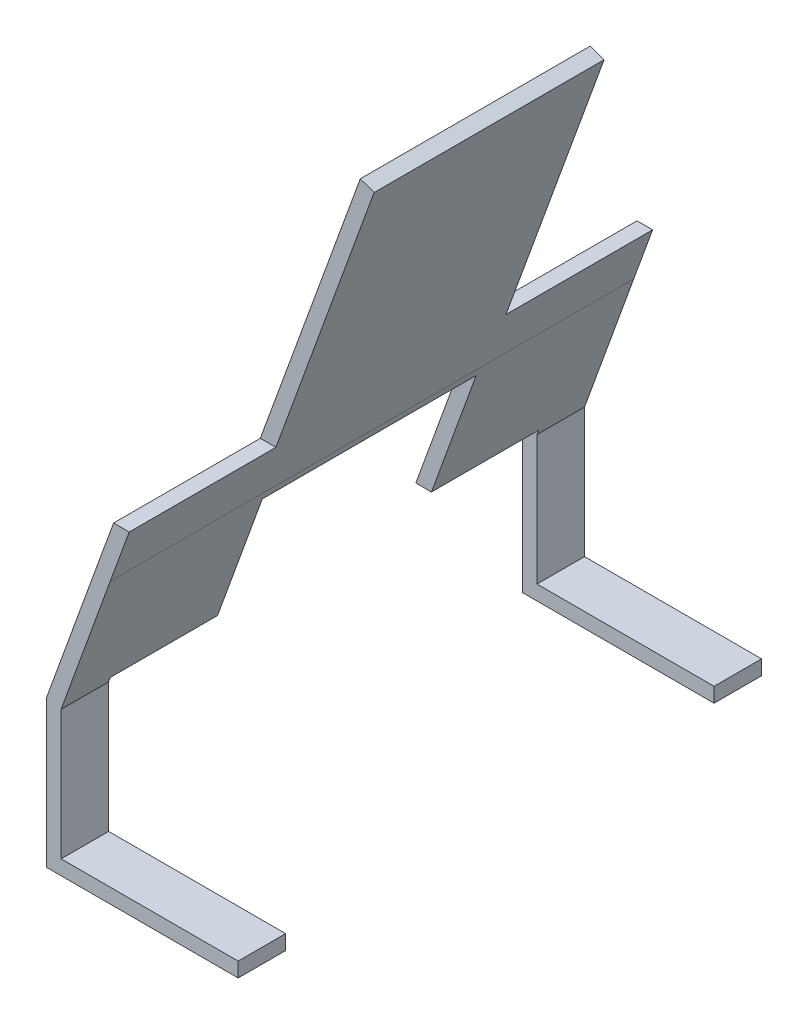
ISO-10303-21;
HEADER;
FILE_DESCRIPTION(('STEP AP214'),'2;1');
FILE_NAME('part.step','',(''),(''),'','','');
FILE_SCHEMA(('AUTOMOTIVE_DESIGN { 1 0 10303 214 1 1 1 1 }'));
ENDSEC;
DATA;
#1=APPLICATION_CONTEXT('core data for automotive mechanical design processes');
#2=APPLICATION_PROTOCOL_DEFINITION('international standard','automotive_design',2000,#1);
#3=PRODUCT_CONTEXT('',#1,'mechanical');
#4=PRODUCT('Part','Part','',(#3));
#5=PRODUCT_RELATED_PRODUCT_CATEGORY('part','',(#4));
#6=PRODUCT_DEFINITION_FORMATION('','',#4);
#7=PRODUCT_DEFINITION_CONTEXT('part definition',#1,'design');
#8=PRODUCT_DEFINITION('design','',#6,#7);
#9=PRODUCT_DEFINITION_SHAPE('','',#8);
#10=(LENGTH_UNIT() NAMED_UNIT(*) SI_UNIT(.MILLI.,.METRE.));
#11=(NAMED_UNIT(*) PLANE_ANGLE_UNIT() SI_UNIT($,.RADIAN.));
#12=(NAMED_UNIT(*) SI_UNIT($,.STERADIAN.) SOLID_ANGLE_UNIT());
#13=UNCERTAINTY_MEASURE_WITH_UNIT(LENGTH_MEASURE(1.E-05),#10,'distance_accuracy_value','');
#14=(GEOMETRIC_REPRESENTATION_CONTEXT(3) GLOBAL_UNCERTAINTY_ASSIGNED_CONTEXT((#13)) GLOBAL_UNIT_ASSIGNED_CONTEXT((#10,
#11,#12)) REPRESENTATION_CONTEXT('',''));
#15=CARTESIAN_POINT('',(0.,0.,0.));
#16=DIRECTION('',(0.,0.,1.));
#17=DIRECTION('',(1.,0.,0.));
#18=AXIS2_PLACEMENT_3D('',#15,#16,#17);
#19=CARTESIAN_POINT('',(-39.1925252630304,0.,107.));
#20=DIRECTION('',(0.,1.,0.));
#21=DIRECTION('',(0.,0.,1.));
#22=AXIS2_PLACEMENT_3D('',#19,#20,#21);
#23=PLANE('',#22);
#24=DIRECTION('',(-1.,0.,0.));
#25=VECTOR('',#24,1.);
#26=CARTESIAN_POINT('',(107.,0.,97.2882216309704));
#27=LINE('',#26,#25);
#28=CARTESIAN_POINT('',(0.,0.,97.2882216309704));
#29=VERTEX_POINT('',#28);
#30=CARTESIAN_POINT('',(-39.1925252630304,0.,97.2882216309704));
#31=VERTEX_POINT('',#30);
#32=EDGE_CURVE('E405',#29,#31,#27,.T.);
#33=ORIENTED_EDGE('',*,*,#32,.F.);
#34=DIRECTION('',(0.,0.,-1.));
#35=VECTOR('',#34,1.);
#36=CARTESIAN_POINT('',(0.,0.,107.));
#37=LINE('',#36,#35);
#38=CARTESIAN_POINT('',(0.,0.,107.));
#39=VERTEX_POINT('',#38);
#40=EDGE_CURVE('E353',#39,#29,#37,.T.);
#41=ORIENTED_EDGE('',*,*,#40,.F.);
#42=DIRECTION('',(1.,0.,0.));
#43=VECTOR('',#42,1.);
#44=CARTESIAN_POINT('',(-39.1925252630304,0.,107.));
#45=LINE('',#44,#43);
#46=CARTESIAN_POINT('',(-39.1925252630304,0.,107.));
#47=VERTEX_POINT('',#46);
#48=EDGE_CURVE('E280',#47,#39,#45,.T.);
#49=ORIENTED_EDGE('',*,*,#48,.F.);
#50=DIRECTION('',(0.,0.,-1.));
#51=VECTOR('',#50,1.);
#52=CARTESIAN_POINT('',(-39.1925252630304,0.,107.));
#53=LINE('',#52,#51);
#54=EDGE_CURVE('E323',#47,#31,#53,.T.);
#55=ORIENTED_EDGE('',*,*,#54,.T.);
#56=EDGE_LOOP('',(#33,#41,#49,#55));
#57=FACE_BOUND('',#56,.T.);
#58=ADVANCED_FACE('F39',(#57),#23,.F.);
#59=DIRECTION('',(-1.,0.,0.));
#60=VECTOR('',#59,1.);
#61=CARTESIAN_POINT('',(107.,0.,9.71177836902959));
#62=LINE('',#61,#60);
#63=CARTESIAN_POINT('',(0.,0.,9.71177836902959));
#64=VERTEX_POINT('',#63);
#65=CARTESIAN_POINT('',(-39.1925252630304,0.,9.71177836902959));
#66=VERTEX_POINT('',#65);
#67=EDGE_CURVE('E388',#64,#66,#62,.T.);
#68=ORIENTED_EDGE('',*,*,#67,.T.);
#69=CARTESIAN_POINT('',(-39.1925252630304,0.,0.));
#70=VERTEX_POINT('',#69);
#71=EDGE_CURVE('E301',#66,#70,#53,.T.);
#72=ORIENTED_EDGE('',*,*,#71,.T.);
#73=DIRECTION('',(1.,0.,0.));
#74=VECTOR('',#73,1.);
#75=CARTESIAN_POINT('',(-39.1925252630304,0.,0.));
#76=LINE('',#75,#74);
#77=CARTESIAN_POINT('',(0.,0.,0.));
#78=VERTEX_POINT('',#77);
#79=EDGE_CURVE('E279',#70,#78,#76,.T.);
#80=ORIENTED_EDGE('',*,*,#79,.T.);
#81=EDGE_CURVE('E352',#64,#78,#37,.T.);
#82=ORIENTED_EDGE('',*,*,#81,.F.);
#83=EDGE_LOOP('',(#68,#72,#80,#82));
#84=FACE_BOUND('',#83,.T.);
#85=ADVANCED_FACE('F411',(#84),#23,.F.);
#86=CARTESIAN_POINT('',(0.,0.,107.));
#87=DIRECTION('',(-1.,0.,0.));
#88=DIRECTION('',(0.,0.,1.));
#89=AXIS2_PLACEMENT_3D('',#86,#87,#88);
#90=PLANE('',#89);
#91=DIRECTION('',(0.,-1.,0.));
#92=VECTOR('',#91,1.);
#93=CARTESIAN_POINT('',(0.,0.,97.2882216309704));
#94=LINE('',#93,#92);
#95=CARTESIAN_POINT('',(0.,3.,97.2882216309704));
#96=VERTEX_POINT('',#95);
#97=EDGE_CURVE('E263',#96,#29,#94,.T.);
#98=ORIENTED_EDGE('',*,*,#97,.F.);
#99=DIRECTION('',(0.,0.,-1.));
#100=VECTOR('',#99,1.);
#101=CARTESIAN_POINT('',(0.,3.,107.));
#102=LINE('',#101,#100);
#103=CARTESIAN_POINT('',(0.,3.,107.));
#104=VERTEX_POINT('',#103);
#105=EDGE_CURVE('E349',#104,#96,#102,.T.);
#106=ORIENTED_EDGE('',*,*,#105,.F.);
#107=DIRECTION('',(0.,1.,0.));
#108=VECTOR('',#107,1.);
#109=CARTESIAN_POINT('',(0.,0.,107.));
#110=LINE('',#109,#108);
#111=EDGE_CURVE('E283',#39,#104,#110,.T.);
#112=ORIENTED_EDGE('',*,*,#111,.F.);
#113=ORIENTED_EDGE('',*,*,#40,.T.);
#114=EDGE_LOOP('',(#98,#106,#112,#113));
#115=FACE_BOUND('',#114,.T.);
#116=ADVANCED_FACE('F485',(#115),#90,.F.);
#117=DIRECTION('',(0.,1.,0.));
#118=VECTOR('',#117,1.);
#119=CARTESIAN_POINT('',(0.,0.,9.71177836902959));
#120=LINE('',#119,#118);
#121=CARTESIAN_POINT('',(0.,3.,9.71177836902959));
#122=VERTEX_POINT('',#121);
#123=EDGE_CURVE('E253',#64,#122,#120,.T.);
#124=ORIENTED_EDGE('',*,*,#123,.F.);
#125=ORIENTED_EDGE('',*,*,#81,.T.);
#126=DIRECTION('',(0.,1.,0.));
#127=VECTOR('',#126,1.);
#128=CARTESIAN_POINT('',(0.,0.,0.));
#129=LINE('',#128,#127);
#130=CARTESIAN_POINT('',(0.,3.,0.));
#131=VERTEX_POINT('',#130);
#132=EDGE_CURVE('E304',#78,#131,#129,.T.);
#133=ORIENTED_EDGE('',*,*,#132,.T.);
#134=EDGE_CURVE('E348',#122,#131,#102,.T.);
#135=ORIENTED_EDGE('',*,*,#134,.F.);
#136=EDGE_LOOP('',(#124,#125,#133,#135));
#137=FACE_BOUND('',#136,.T.);
#138=ADVANCED_FACE('F426',(#137),#90,.F.);
#139=CARTESIAN_POINT('',(0.,3.,107.));
#140=DIRECTION('',(0.,-1.,0.));
#141=DIRECTION('',(1.,0.,0.));
#142=AXIS2_PLACEMENT_3D('',#139,#140,#141);
#143=PLANE('',#142);
#144=DIRECTION('',(1.,0.,0.));
#145=VECTOR('',#144,1.);
#146=CARTESIAN_POINT('',(0.,3.,97.2882216309704));
#147=LINE('',#146,#145);
#148=CARTESIAN_POINT('',(-36.1925252630304,3.,97.2882216309704));
#149=VERTEX_POINT('',#148);
#150=EDGE_CURVE('E261',#149,#96,#147,.T.);
#151=ORIENTED_EDGE('',*,*,#150,.F.);
#152=DIRECTION('',(0.,0.,-1.));
#153=VECTOR('',#152,1.);
#154=CARTESIAN_POINT('',(-36.1925252630304,3.,107.));
#155=LINE('',#154,#153);
#156=CARTESIAN_POINT('',(-36.1925252630304,3.,107.));
#157=VERTEX_POINT('',#156);
#158=EDGE_CURVE('E345',#157,#149,#155,.T.);
#159=ORIENTED_EDGE('',*,*,#158,.F.);
#160=DIRECTION('',(-1.,0.,0.));
#161=VECTOR('',#160,1.);
#162=CARTESIAN_POINT('',(0.,3.,107.));
#163=LINE('',#162,#161);
#164=EDGE_CURVE('E286',#104,#157,#163,.T.);
#165=ORIENTED_EDGE('',*,*,#164,.F.);
#166=ORIENTED_EDGE('',*,*,#105,.T.);
#167=EDGE_LOOP('',(#151,#159,#165,#166));
#168=FACE_BOUND('',#167,.T.);
#169=ADVANCED_FACE('F482',(#168),#143,.F.);
#170=DIRECTION('',(-1.,0.,0.));
#171=VECTOR('',#170,1.);
#172=CARTESIAN_POINT('',(0.,3.,9.71177836902959));
#173=LINE('',#172,#171);
#174=CARTESIAN_POINT('',(-36.1925252630304,3.,9.71177836902959));
#175=VERTEX_POINT('',#174);
#176=EDGE_CURVE('E251',#122,#175,#173,.T.);
#177=ORIENTED_EDGE('',*,*,#176,.F.);
#178=ORIENTED_EDGE('',*,*,#134,.T.);
#179=DIRECTION('',(-1.,0.,0.));
#180=VECTOR('',#179,1.);
#181=CARTESIAN_POINT('',(0.,3.,0.));
#182=LINE('',#181,#180);
#183=CARTESIAN_POINT('',(-36.1925252630304,3.,0.));
#184=VERTEX_POINT('',#183);
#185=EDGE_CURVE('E307',#131,#184,#182,.T.);
#186=ORIENTED_EDGE('',*,*,#185,.T.);
#187=EDGE_CURVE('E344',#175,#184,#155,.T.);
#188=ORIENTED_EDGE('',*,*,#187,.F.);
#189=EDGE_LOOP('',(#177,#178,#186,#188));
#190=FACE_BOUND('',#189,.T.);
#191=ADVANCED_FACE('F432',(#190),#143,.F.);
#192=CARTESIAN_POINT('',(-36.1925252630304,3.,107.));
#193=DIRECTION('',(-1.,0.,0.));
#194=DIRECTION('',(0.,0.,1.));
#195=AXIS2_PLACEMENT_3D('',#192,#193,#194);
#196=PLANE('',#195);
#197=DIRECTION('',(0.,-1.,0.));
#198=VECTOR('',#197,1.);
#199=CARTESIAN_POINT('',(-36.1925252630304,3.,97.2882216309704));
#200=LINE('',#199,#198);
#201=CARTESIAN_POINT('',(-36.1925252630304,29.472692743285,97.2882216309704));
#202=VERTEX_POINT('',#201);
#203=EDGE_CURVE('E259',#202,#149,#200,.T.);
#204=ORIENTED_EDGE('',*,*,#203,.F.);
#205=DIRECTION('',(0.,0.,-1.));
#206=VECTOR('',#205,1.);
#207=CARTESIAN_POINT('',(-36.1925252630304,29.472692743285,107.));
#208=LINE('',#207,#206);
#209=CARTESIAN_POINT('',(-36.1925252630304,29.472692743285,107.));
#210=VERTEX_POINT('',#209);
#211=EDGE_CURVE('E341',#210,#202,#208,.T.);
#212=ORIENTED_EDGE('',*,*,#211,.F.);
#213=DIRECTION('',(0.,1.,0.));
#214=VECTOR('',#213,1.);
#215=CARTESIAN_POINT('',(-36.1925252630304,3.,107.));
#216=LINE('',#215,#214);
#217=EDGE_CURVE('E288',#157,#210,#216,.T.);
#218=ORIENTED_EDGE('',*,*,#217,.F.);
#219=ORIENTED_EDGE('',*,*,#158,.T.);
#220=EDGE_LOOP('',(#204,#212,#218,#219));
#221=FACE_BOUND('',#220,.T.);
#222=ADVANCED_FACE('F475',(#221),#196,.F.);
#223=DIRECTION('',(0.,1.,0.));
#224=VECTOR('',#223,1.);
#225=CARTESIAN_POINT('',(-36.1925252630304,3.,9.71177836902959));
#226=LINE('',#225,#224);
#227=CARTESIAN_POINT('',(-36.1925252630304,29.472692743285,9.71177836902959));
#228=VERTEX_POINT('',#227);
#229=EDGE_CURVE('E249',#175,#228,#226,.T.);
#230=ORIENTED_EDGE('',*,*,#229,.F.);
#231=ORIENTED_EDGE('',*,*,#187,.T.);
#232=DIRECTION('',(0.,1.,0.));
#233=VECTOR('',#232,1.);
#234=CARTESIAN_POINT('',(-36.1925252630304,3.,0.));
#235=LINE('',#234,#233);
#236=CARTESIAN_POINT('',(-36.1925252630304,29.472692743285,0.));
#237=VERTEX_POINT('',#236);
#238=EDGE_CURVE('E310',#184,#237,#235,.T.);
#239=ORIENTED_EDGE('',*,*,#238,.T.);
#240=EDGE_CURVE('E340',#228,#237,#208,.T.);
#241=ORIENTED_EDGE('',*,*,#240,.F.);
#242=EDGE_LOOP('',(#230,#231,#239,#241));
#243=FACE_BOUND('',#242,.T.);
#244=ADVANCED_FACE('F434',(#243),#196,.F.);
#245=CARTESIAN_POINT('',(-36.1925252630304,29.472692743285,107.));
#246=DIRECTION('',(-0.940062221094664,0.341002962553946,0.));
#247=DIRECTION('',(-0.341002962553946,-0.940062221094664,0.));
#248=AXIS2_PLACEMENT_3D('',#245,#246,#247);
#249=PLANE('',#248);
#250=DIRECTION('',(-0.341002962553946,-0.940062221094664,0.));
#251=VECTOR('',#250,1.);
#252=CARTESIAN_POINT('',(-36.1925252630304,29.472692743285,97.2882216309704));
#253=LINE('',#252,#251);
#254=CARTESIAN_POINT('',(-35.8455169501418,30.4293102544913,97.2882216309704));
#255=VERTEX_POINT('',#254);
#256=EDGE_CURVE('E257',#255,#202,#253,.T.);
#257=ORIENTED_EDGE('',*,*,#256,.F.);
#258=DIRECTION('',(0.,0.,1.));
#259=VECTOR('',#258,1.);
#260=CARTESIAN_POINT('',(-35.8455169501418,30.4293102544913,107.));
#261=LINE('',#260,#259);
#262=CARTESIAN_POINT('',(-35.8455169501418,30.4293102544913,75.3624261399201));
#263=VERTEX_POINT('',#262);
#264=EDGE_CURVE('E265',#263,#255,#261,.T.);
#265=ORIENTED_EDGE('',*,*,#264,.F.);
#266=DIRECTION('',(-0.341002962553946,-0.940062221094664,0.));
#267=VECTOR('',#266,1.);
#268=CARTESIAN_POINT('',(-36.1925252630304,29.472692743285,75.3624261399201));
#269=LINE('',#268,#267);
#270=CARTESIAN_POINT('',(-26.6967221977558,55.6503120043122,75.3624261399201));
#271=VERTEX_POINT('',#270);
#272=EDGE_CURVE('E267',#271,#263,#269,.T.);
#273=ORIENTED_EDGE('',*,*,#272,.F.);
#274=DIRECTION('',(0.,0.,1.));
#275=VECTOR('',#274,1.);
#276=CARTESIAN_POINT('',(-26.6967221977558,55.6503120043122,107.));
#277=LINE('',#276,#275);
#278=CARTESIAN_POINT('',(-26.6967221977558,55.6503120043122,31.6375738600799));
#279=VERTEX_POINT('',#278);
#280=EDGE_CURVE('E269',#279,#271,#277,.T.);
#281=ORIENTED_EDGE('',*,*,#280,.F.);
#282=DIRECTION('',(0.341002962553946,0.940062221094664,0.));
#283=VECTOR('',#282,1.);
#284=CARTESIAN_POINT('',(-36.1925252630304,29.472692743285,31.6375738600799));
#285=LINE('',#284,#283);
#286=CARTESIAN_POINT('',(-35.8455169501418,30.4293102544913,31.6375738600799));
#287=VERTEX_POINT('',#286);
#288=EDGE_CURVE('E271',#287,#279,#285,.T.);
#289=ORIENTED_EDGE('',*,*,#288,.F.);
#290=DIRECTION('',(0.,0.,1.));
#291=VECTOR('',#290,1.);
#292=CARTESIAN_POINT('',(-35.8455169501418,30.4293102544913,107.));
#293=LINE('',#292,#291);
#294=CARTESIAN_POINT('',(-35.8455169501418,30.4293102544913,9.71177836902959));
#295=VERTEX_POINT('',#294);
#296=EDGE_CURVE('E273',#295,#287,#293,.T.);
#297=ORIENTED_EDGE('',*,*,#296,.F.);
#298=DIRECTION('',(0.341002962553946,0.940062221094664,0.));
#299=VECTOR('',#298,1.);
#300=CARTESIAN_POINT('',(-36.1925252630304,29.472692743285,9.71177836902959));
#301=LINE('',#300,#299);
#302=EDGE_CURVE('E247',#228,#295,#301,.T.);
#303=ORIENTED_EDGE('',*,*,#302,.F.);
#304=ORIENTED_EDGE('',*,*,#240,.T.);
#305=DIRECTION('',(0.341002962553946,0.940062221094664,0.));
#306=VECTOR('',#305,1.);
#307=CARTESIAN_POINT('',(-36.1925252630304,29.472692743285,0.));
#308=LINE('',#307,#306);
#309=CARTESIAN_POINT('',(-26.1428032979597,57.1773316740204,0.));
#310=VERTEX_POINT('',#309);
#311=EDGE_CURVE('E313',#237,#310,#308,.T.);
#312=ORIENTED_EDGE('',*,*,#311,.T.);
#313=DIRECTION('',(0.,0.,-1.));
#314=VECTOR('',#313,1.);
#315=CARTESIAN_POINT('',(-26.1428032979597,57.1773316740204,107.));
#316=LINE('',#315,#314);
#317=CARTESIAN_POINT('',(-26.1428032979597,57.1773316740204,107.));
#318=VERTEX_POINT('',#317);
#319=EDGE_CURVE('E338',#318,#310,#316,.T.);
#320=ORIENTED_EDGE('',*,*,#319,.F.);
#321=DIRECTION('',(0.341002962553946,0.940062221094664,0.));
#322=VECTOR('',#321,1.);
#323=CARTESIAN_POINT('',(-36.1925252630304,29.472692743285,107.));
#324=LINE('',#323,#322);
#325=EDGE_CURVE('E290',#210,#318,#324,.T.);
#326=ORIENTED_EDGE('',*,*,#325,.F.);
#327=ORIENTED_EDGE('',*,*,#211,.T.);
#328=EDGE_LOOP('',(#257,#265,#273,#281,#289,#297,#303,#304,#312,#320,#326,#327));
#329=FACE_BOUND('',#328,.T.);
#330=ADVANCED_FACE('F442',(#329),#249,.F.);
#331=CARTESIAN_POINT('',(-26.1428032979597,57.1773316740204,107.));
#332=DIRECTION('',(-0.939692620785909,0.342020143325666,0.));
#333=DIRECTION('',(-0.342020143325666,-0.93969262078591,0.));
#334=AXIS2_PLACEMENT_3D('',#331,#332,#333);
#335=PLANE('',#334);
#336=DIRECTION('',(0.,0.,-1.));
#337=VECTOR('',#336,1.);
#338=CARTESIAN_POINT('',(-22.2701979502503,67.8172274213112,107.));
#339=LINE('',#338,#337);
#340=CARTESIAN_POINT('',(-22.2701979502503,67.8172274213112,107.));
#341=VERTEX_POINT('',#340);
#342=CARTESIAN_POINT('',(-22.2701979502503,67.8172274213112,77.0100292693054));
#343=VERTEX_POINT('',#342);
#344=EDGE_CURVE('E240',#341,#343,#339,.T.);
#345=ORIENTED_EDGE('',*,*,#344,.F.);
#346=DIRECTION('',(0.342020143325666,0.93969262078591,0.));
#347=VECTOR('',#346,1.);
#348=CARTESIAN_POINT('',(-26.1428032979597,57.1773316740204,107.));
#349=LINE('',#348,#347);
#350=EDGE_CURVE('E292',#318,#341,#349,.T.);
#351=ORIENTED_EDGE('',*,*,#350,.F.);
#352=ORIENTED_EDGE('',*,*,#319,.T.);
#353=DIRECTION('',(0.342020143325666,0.93969262078591,0.));
#354=VECTOR('',#353,1.);
#355=CARTESIAN_POINT('',(-26.1428032979597,57.1773316740204,0.));
#356=LINE('',#355,#354);
#357=CARTESIAN_POINT('',(-22.2701979502503,67.8172274213112,0.));
#358=VERTEX_POINT('',#357);
#359=EDGE_CURVE('E238',#310,#358,#356,.T.);
#360=ORIENTED_EDGE('',*,*,#359,.T.);
#361=DIRECTION('',(0.,0.,-1.));
#362=VECTOR('',#361,1.);
#363=CARTESIAN_POINT('',(-22.2701979502503,67.8172274213112,107.));
#364=LINE('',#363,#362);
#365=CARTESIAN_POINT('',(-22.2701979502503,67.8172274213112,29.9899707306946));
#366=VERTEX_POINT('',#365);
#367=EDGE_CURVE('E227',#366,#358,#364,.T.);
#368=ORIENTED_EDGE('',*,*,#367,.F.);
#369=DIRECTION('',(-0.342020143325666,-0.93969262078591,0.));
#370=VECTOR('',#369,1.);
#371=CARTESIAN_POINT('',(-26.1428032979597,57.1773316740204,29.9899707306946));
#372=LINE('',#371,#370);
#373=CARTESIAN_POINT('',(-2.20194849125767,122.954289657877,29.9899707306946));
#374=VERTEX_POINT('',#373);
#375=EDGE_CURVE('E212',#374,#366,#372,.T.);
#376=ORIENTED_EDGE('',*,*,#375,.F.);
#377=DIRECTION('',(0.,0.,-1.));
#378=VECTOR('',#377,1.);
#379=CARTESIAN_POINT('',(-2.20194849125767,122.954289657877,107.));
#380=LINE('',#379,#378);
#381=CARTESIAN_POINT('',(-2.20194849125767,122.954289657877,77.0100292693054));
#382=VERTEX_POINT('',#381);
#383=EDGE_CURVE('E336',#382,#374,#380,.T.);
#384=ORIENTED_EDGE('',*,*,#383,.F.);
#385=DIRECTION('',(0.342020143325666,0.93969262078591,0.));
#386=VECTOR('',#385,1.);
#387=CARTESIAN_POINT('',(-26.1428032979597,57.1773316740204,77.0100292693054));
#388=LINE('',#387,#386);
#389=EDGE_CURVE('E277',#343,#382,#388,.T.);
#390=ORIENTED_EDGE('',*,*,#389,.F.);
#391=EDGE_LOOP('',(#345,#351,#352,#360,#368,#376,#384,#390));
#392=FACE_BOUND('',#391,.T.);
#393=ADVANCED_FACE('F235',(#392),#335,.F.);
#394=CARTESIAN_POINT('',(-2.20194849125767,122.954289657877,107.));
#395=DIRECTION('',(-0.342020143325666,-0.939692620785909,0.));
#396=DIRECTION('',(0.939692620785909,-0.342020143325666,0.));
#397=AXIS2_PLACEMENT_3D('',#394,#395,#396);
#398=PLANE('',#397);
#399=DIRECTION('',(-0.939692620785909,0.342020143325666,0.));
#400=VECTOR('',#399,1.);
#401=CARTESIAN_POINT('',(-2.20194849125767,122.954289657877,77.0100292693054));
#402=LINE('',#401,#400);
#403=CARTESIAN_POINT('',(-5.02102635361543,123.980350087854,77.0100292693054));
#404=VERTEX_POINT('',#403);
#405=EDGE_CURVE('E223',#382,#404,#402,.T.);
#406=ORIENTED_EDGE('',*,*,#405,.F.);
#407=ORIENTED_EDGE('',*,*,#383,.T.);
#408=DIRECTION('',(0.939692620785909,-0.342020143325666,0.));
#409=VECTOR('',#408,1.);
#410=CARTESIAN_POINT('',(-2.20194849125768,122.954289657877,29.9899707306946));
#411=LINE('',#410,#409);
#412=CARTESIAN_POINT('',(-5.02102635361541,123.980350087854,29.9899707306946));
#413=VERTEX_POINT('',#412);
#414=EDGE_CURVE('E218',#413,#374,#411,.T.);
#415=ORIENTED_EDGE('',*,*,#414,.F.);
#416=DIRECTION('',(0.,0.,-1.));
#417=VECTOR('',#416,1.);
#418=CARTESIAN_POINT('',(-5.02102635361543,123.980350087854,107.));
#419=LINE('',#418,#417);
#420=EDGE_CURVE('E333',#404,#413,#419,.T.);
#421=ORIENTED_EDGE('',*,*,#420,.F.);
#422=EDGE_LOOP('',(#406,#407,#415,#421));
#423=FACE_BOUND('',#422,.T.);
#424=ADVANCED_FACE('F377',(#423),#398,.F.);
#425=CARTESIAN_POINT('',(-5.02102635361543,123.980350087854,107.));
#426=DIRECTION('',(0.93969262078591,-0.342020143325665,0.));
#427=DIRECTION('',(0.342020143325665,0.93969262078591,0.));
#428=AXIS2_PLACEMENT_3D('',#425,#426,#427);
#429=PLANE('',#428);
#430=DIRECTION('',(0.,0.,1.));
#431=VECTOR('',#430,1.);
#432=CARTESIAN_POINT('',(-25.4627312676781,67.8172274213112,107.));
#433=LINE('',#432,#431);
#434=CARTESIAN_POINT('',(-25.4627312676781,67.8172274213112,77.0100292693054));
#435=VERTEX_POINT('',#434);
#436=CARTESIAN_POINT('',(-25.4627312676781,67.8172274213112,107.));
#437=VERTEX_POINT('',#436);
#438=EDGE_CURVE('E61',#435,#437,#433,.T.);
#439=ORIENTED_EDGE('',*,*,#438,.F.);
#440=DIRECTION('',(-0.342020143325665,-0.93969262078591,0.));
#441=VECTOR('',#440,1.);
#442=CARTESIAN_POINT('',(-5.02102635361543,123.980350087854,77.0100292693054));
#443=LINE('',#442,#441);
#444=EDGE_CURVE('E11',#404,#435,#443,.T.);
#445=ORIENTED_EDGE('',*,*,#444,.F.);
#446=ORIENTED_EDGE('',*,*,#420,.T.);
#447=DIRECTION('',(0.342020143325665,0.93969262078591,0.));
#448=VECTOR('',#447,1.);
#449=CARTESIAN_POINT('',(-5.02102635361542,123.980350087854,29.9899707306946));
#450=LINE('',#449,#448);
#451=CARTESIAN_POINT('',(-25.4627312676781,67.8172274213112,29.9899707306946));
#452=VERTEX_POINT('',#451);
#453=EDGE_CURVE('E46',#452,#413,#450,.T.);
#454=ORIENTED_EDGE('',*,*,#453,.F.);
#455=DIRECTION('',(0.,0.,1.));
#456=VECTOR('',#455,1.);
#457=CARTESIAN_POINT('',(-25.4627312676781,67.8172274213112,107.));
#458=LINE('',#457,#456);
#459=CARTESIAN_POINT('',(-25.4627312676781,67.8172274213112,0.));
#460=VERTEX_POINT('',#459);
#461=EDGE_CURVE('E230',#460,#452,#458,.T.);
#462=ORIENTED_EDGE('',*,*,#461,.F.);
#463=DIRECTION('',(-0.342020143325665,-0.93969262078591,0.));
#464=VECTOR('',#463,1.);
#465=CARTESIAN_POINT('',(-5.02102635361543,123.980350087854,0.));
#466=LINE('',#465,#464);
#467=CARTESIAN_POINT('',(-28.962436386412,58.2018666328399,0.));
#468=VERTEX_POINT('',#467);
#469=EDGE_CURVE('E316',#460,#468,#466,.T.);
#470=ORIENTED_EDGE('',*,*,#469,.T.);
#471=DIRECTION('',(0.,0.,-1.));
#472=VECTOR('',#471,1.);
#473=CARTESIAN_POINT('',(-28.962436386412,58.2018666328399,107.));
#474=LINE('',#473,#472);
#475=CARTESIAN_POINT('',(-28.962436386412,58.2018666328399,107.));
#476=VERTEX_POINT('',#475);
#477=EDGE_CURVE('E330',#476,#468,#474,.T.);
#478=ORIENTED_EDGE('',*,*,#477,.F.);
#479=DIRECTION('',(-0.342020143325665,-0.93969262078591,0.));
#480=VECTOR('',#479,1.);
#481=CARTESIAN_POINT('',(-5.02102635361543,123.980350087854,107.));
#482=LINE('',#481,#480);
#483=EDGE_CURVE('E295',#437,#476,#482,.T.);
#484=ORIENTED_EDGE('',*,*,#483,.F.);
#485=EDGE_LOOP('',(#439,#445,#446,#454,#462,#470,#478,#484));
#486=FACE_BOUND('',#485,.T.);
#487=ADVANCED_FACE('F379',(#486),#429,.F.);
#488=CARTESIAN_POINT('',(-28.962436386412,58.2018666328399,107.));
#489=DIRECTION('',(0.940062221094664,-0.341002962553946,0.));
#490=DIRECTION('',(0.341002962553946,0.940062221094664,0.));
#491=AXIS2_PLACEMENT_3D('',#488,#489,#490);
#492=PLANE('',#491);
#493=DIRECTION('',(0.341002962553946,0.940062221094664,0.));
#494=VECTOR('',#493,1.);
#495=CARTESIAN_POINT('',(-28.962436386412,58.2018666328399,97.2882216309704));
#496=LINE('',#495,#494);
#497=CARTESIAN_POINT('',(-39.1925252630304,30.,97.2882216309704));
#498=VERTEX_POINT('',#497);
#499=CARTESIAN_POINT('',(-39.0367950726757,30.4293102544913,97.2882216309704));
#500=VERTEX_POINT('',#499);
#501=EDGE_CURVE('E255',#498,#500,#496,.T.);
#502=ORIENTED_EDGE('',*,*,#501,.F.);
#503=DIRECTION('',(0.,0.,-1.));
#504=VECTOR('',#503,1.);
#505=CARTESIAN_POINT('',(-39.1925252630304,30.,107.));
#506=LINE('',#505,#504);
#507=CARTESIAN_POINT('',(-39.1925252630304,30.,107.));
#508=VERTEX_POINT('',#507);
#509=EDGE_CURVE('E327',#508,#498,#506,.T.);
#510=ORIENTED_EDGE('',*,*,#509,.F.);
#511=DIRECTION('',(-0.341002962553946,-0.940062221094663,0.));
#512=VECTOR('',#511,1.);
#513=CARTESIAN_POINT('',(-28.962436386412,58.2018666328399,107.));
#514=LINE('',#513,#512);
#515=EDGE_CURVE('E297',#476,#508,#514,.T.);
#516=ORIENTED_EDGE('',*,*,#515,.F.);
#517=ORIENTED_EDGE('',*,*,#477,.T.);
#518=DIRECTION('',(-0.341002962553946,-0.940062221094663,0.));
#519=VECTOR('',#518,1.);
#520=CARTESIAN_POINT('',(-28.962436386412,58.2018666328399,0.));
#521=LINE('',#520,#519);
#522=CARTESIAN_POINT('',(-39.1925252630304,30.,0.));
#523=VERTEX_POINT('',#522);
#524=EDGE_CURVE('E318',#468,#523,#521,.T.);
#525=ORIENTED_EDGE('',*,*,#524,.T.);
#526=CARTESIAN_POINT('',(-39.1925252630304,30.,9.71177836902959));
#527=VERTEX_POINT('',#526);
#528=EDGE_CURVE('E326',#527,#523,#506,.T.);
#529=ORIENTED_EDGE('',*,*,#528,.F.);
#530=DIRECTION('',(-0.341002962553946,-0.940062221094664,0.));
#531=VECTOR('',#530,1.);
#532=CARTESIAN_POINT('',(-28.962436386412,58.2018666328399,9.71177836902959));
#533=LINE('',#532,#531);
#534=CARTESIAN_POINT('',(-39.0367950726757,30.4293102544913,9.71177836902959));
#535=VERTEX_POINT('',#534);
#536=EDGE_CURVE('E53',#535,#527,#533,.T.);
#537=ORIENTED_EDGE('',*,*,#536,.F.);
#538=DIRECTION('',(0.,0.,-1.));
#539=VECTOR('',#538,1.);
#540=CARTESIAN_POINT('',(-39.0367950726757,30.4293102544913,107.));
#541=LINE('',#540,#539);
#542=CARTESIAN_POINT('',(-39.0367950726757,30.4293102544913,31.6375738600799));
#543=VERTEX_POINT('',#542);
#544=EDGE_CURVE('E364',#543,#535,#541,.T.);
#545=ORIENTED_EDGE('',*,*,#544,.F.);
#546=DIRECTION('',(-0.341002962553946,-0.940062221094664,0.));
#547=VECTOR('',#546,1.);
#548=CARTESIAN_POINT('',(-28.962436386412,58.2018666328399,31.6375738600799));
#549=LINE('',#548,#547);
#550=CARTESIAN_POINT('',(-29.8880003202897,55.6503120043122,31.6375738600799));
#551=VERTEX_POINT('',#550);
#552=EDGE_CURVE('E366',#551,#543,#549,.T.);
#553=ORIENTED_EDGE('',*,*,#552,.F.);
#554=DIRECTION('',(0.,0.,-1.));
#555=VECTOR('',#554,1.);
#556=CARTESIAN_POINT('',(-29.8880003202897,55.6503120043122,107.));
#557=LINE('',#556,#555);
#558=CARTESIAN_POINT('',(-29.8880003202897,55.6503120043122,75.3624261399201));
#559=VERTEX_POINT('',#558);
#560=EDGE_CURVE('E368',#559,#551,#557,.T.);
#561=ORIENTED_EDGE('',*,*,#560,.F.);
#562=DIRECTION('',(0.341002962553946,0.940062221094664,0.));
#563=VECTOR('',#562,1.);
#564=CARTESIAN_POINT('',(-28.962436386412,58.2018666328399,75.3624261399201));
#565=LINE('',#564,#563);
#566=CARTESIAN_POINT('',(-39.0367950726757,30.4293102544913,75.3624261399201));
#567=VERTEX_POINT('',#566);
#568=EDGE_CURVE('E370',#567,#559,#565,.T.);
#569=ORIENTED_EDGE('',*,*,#568,.F.);
#570=DIRECTION('',(0.,0.,-1.));
#571=VECTOR('',#570,1.);
#572=CARTESIAN_POINT('',(-39.0367950726757,30.4293102544913,107.));
#573=LINE('',#572,#571);
#574=EDGE_CURVE('E372',#500,#567,#573,.T.);
#575=ORIENTED_EDGE('',*,*,#574,.F.);
#576=EDGE_LOOP('',(#502,#510,#516,#517,#525,#529,#537,#545,#553,#561,#569,#575));
#577=FACE_BOUND('',#576,.T.);
#578=ADVANCED_FACE('F456',(#577),#492,.F.);
#579=CARTESIAN_POINT('',(-39.1925252630304,30.,107.));
#580=DIRECTION('',(1.,0.,0.));
#581=DIRECTION('',(0.,1.,0.));
#582=AXIS2_PLACEMENT_3D('',#579,#580,#581);
#583=PLANE('',#582);
#584=DIRECTION('',(0.,1.,0.));
#585=VECTOR('',#584,1.);
#586=CARTESIAN_POINT('',(-39.1925252630304,30.,97.2882216309704));
#587=LINE('',#586,#585);
#588=EDGE_CURVE('E362',#31,#498,#587,.T.);
#589=ORIENTED_EDGE('',*,*,#588,.F.);
#590=ORIENTED_EDGE('',*,*,#54,.F.);
#591=DIRECTION('',(0.,-1.,0.));
#592=VECTOR('',#591,1.);
#593=CARTESIAN_POINT('',(-39.1925252630304,30.,107.));
#594=LINE('',#593,#592);
#595=EDGE_CURVE('E299',#508,#47,#594,.T.);
#596=ORIENTED_EDGE('',*,*,#595,.F.);
#597=ORIENTED_EDGE('',*,*,#509,.T.);
#598=EDGE_LOOP('',(#589,#590,#596,#597));
#599=FACE_BOUND('',#598,.T.);
#600=ADVANCED_FACE('F492',(#599),#583,.F.);
#601=DIRECTION('',(0.,-1.,0.));
#602=VECTOR('',#601,1.);
#603=CARTESIAN_POINT('',(-39.1925252630304,30.,9.71177836902959));
#604=LINE('',#603,#602);
#605=EDGE_CURVE('E360',#527,#66,#604,.T.);
#606=ORIENTED_EDGE('',*,*,#605,.F.);
#607=ORIENTED_EDGE('',*,*,#528,.T.);
#608=DIRECTION('',(0.,-1.,0.));
#609=VECTOR('',#608,1.);
#610=CARTESIAN_POINT('',(-39.1925252630304,30.,0.));
#611=LINE('',#610,#609);
#612=EDGE_CURVE('E284',#523,#70,#611,.T.);
#613=ORIENTED_EDGE('',*,*,#612,.T.);
#614=ORIENTED_EDGE('',*,*,#71,.F.);
#615=EDGE_LOOP('',(#606,#607,#613,#614));
#616=FACE_BOUND('',#615,.T.);
#617=ADVANCED_FACE('F414',(#616),#583,.F.);
#618=CARTESIAN_POINT('',(0.,0.,107.));
#619=DIRECTION('',(0.,0.,1.));
#620=DIRECTION('',(1.,0.,0.));
#621=AXIS2_PLACEMENT_3D('',#618,#619,#620);
#622=PLANE('',#621);
#623=ORIENTED_EDGE('',*,*,#350,.T.);
#624=DIRECTION('',(-1.,0.,0.));
#625=VECTOR('',#624,1.);
#626=CARTESIAN_POINT('',(0.,67.8172274213112,107.));
#627=LINE('',#626,#625);
#628=EDGE_CURVE('E358',#341,#437,#627,.T.);
#629=ORIENTED_EDGE('',*,*,#628,.T.);
#630=ORIENTED_EDGE('',*,*,#483,.T.);
#631=ORIENTED_EDGE('',*,*,#515,.T.);
#632=ORIENTED_EDGE('',*,*,#595,.T.);
#633=ORIENTED_EDGE('',*,*,#48,.T.);
#634=ORIENTED_EDGE('',*,*,#111,.T.);
#635=ORIENTED_EDGE('',*,*,#164,.T.);
#636=ORIENTED_EDGE('',*,*,#217,.T.);
#637=ORIENTED_EDGE('',*,*,#325,.T.);
#638=EDGE_LOOP('',(#623,#629,#630,#631,#632,#633,#634,#635,#636,#637));
#639=FACE_BOUND('',#638,.T.);
#640=ADVANCED_FACE('F464',(#639),#622,.T.);
#641=CARTESIAN_POINT('',(0.,0.,0.));
#642=DIRECTION('',(0.,0.,1.));
#643=DIRECTION('',(1.,0.,0.));
#644=AXIS2_PLACEMENT_3D('',#641,#642,#643);
#645=PLANE('',#644);
#646=DIRECTION('',(-1.,0.,0.));
#647=VECTOR('',#646,1.);
#648=CARTESIAN_POINT('',(0.,67.8172274213112,0.));
#649=LINE('',#648,#647);
#650=EDGE_CURVE('E356',#358,#460,#649,.T.);
#651=ORIENTED_EDGE('',*,*,#650,.F.);
#652=ORIENTED_EDGE('',*,*,#359,.F.);
#653=ORIENTED_EDGE('',*,*,#311,.F.);
#654=ORIENTED_EDGE('',*,*,#238,.F.);
#655=ORIENTED_EDGE('',*,*,#185,.F.);
#656=ORIENTED_EDGE('',*,*,#132,.F.);
#657=ORIENTED_EDGE('',*,*,#79,.F.);
#658=ORIENTED_EDGE('',*,*,#612,.F.);
#659=ORIENTED_EDGE('',*,*,#524,.F.);
#660=ORIENTED_EDGE('',*,*,#469,.F.);
#661=EDGE_LOOP('',(#651,#652,#653,#654,#655,#656,#657,#658,#659,#660));
#662=FACE_BOUND('',#661,.T.);
#663=ADVANCED_FACE('F421',(#662),#645,.F.);
#664=CARTESIAN_POINT('',(107.,123.980350087854,29.9899707306946));
#665=DIRECTION('',(0.,0.,-1.));
#666=DIRECTION('',(0.,1.,0.));
#667=AXIS2_PLACEMENT_3D('',#664,#665,#666);
#668=PLANE('',#667);
#669=ORIENTED_EDGE('',*,*,#375,.T.);
#670=DIRECTION('',(-1.,0.,0.));
#671=VECTOR('',#670,1.);
#672=CARTESIAN_POINT('',(107.,67.8172274213112,29.9899707306946));
#673=LINE('',#672,#671);
#674=EDGE_CURVE('E215',#366,#452,#673,.T.);
#675=ORIENTED_EDGE('',*,*,#674,.T.);
#676=ORIENTED_EDGE('',*,*,#453,.T.);
#677=ORIENTED_EDGE('',*,*,#414,.T.);
#678=EDGE_LOOP('',(#669,#675,#676,#677));
#679=FACE_BOUND('',#678,.T.);
#680=ADVANCED_FACE('F214',(#679),#668,.T.);
#681=CARTESIAN_POINT('',(107.,67.8172274213112,0.));
#682=DIRECTION('',(0.,1.,0.));
#683=DIRECTION('',(0.,0.,1.));
#684=AXIS2_PLACEMENT_3D('',#681,#682,#683);
#685=PLANE('',#684);
#686=ORIENTED_EDGE('',*,*,#367,.T.);
#687=ORIENTED_EDGE('',*,*,#650,.T.);
#688=ORIENTED_EDGE('',*,*,#461,.T.);
#689=ORIENTED_EDGE('',*,*,#674,.F.);
#690=EDGE_LOOP('',(#686,#687,#688,#689));
#691=FACE_BOUND('',#690,.T.);
#692=ADVANCED_FACE('F226',(#691),#685,.T.);
#693=CARTESIAN_POINT('',(107.,123.980350087854,77.0100292693054));
#694=DIRECTION('',(0.,0.,1.));
#695=DIRECTION('',(1.,0.,0.));
#696=AXIS2_PLACEMENT_3D('',#693,#694,#695);
#697=PLANE('',#696);
#698=ORIENTED_EDGE('',*,*,#389,.T.);
#699=ORIENTED_EDGE('',*,*,#405,.T.);
#700=ORIENTED_EDGE('',*,*,#444,.T.);
#701=DIRECTION('',(-1.,0.,0.));
#702=VECTOR('',#701,1.);
#703=CARTESIAN_POINT('',(107.,67.8172274213112,77.0100292693054));
#704=LINE('',#703,#702);
#705=EDGE_CURVE('E231',#343,#435,#704,.T.);
#706=ORIENTED_EDGE('',*,*,#705,.F.);
#707=EDGE_LOOP('',(#698,#699,#700,#706));
#708=FACE_BOUND('',#707,.T.);
#709=ADVANCED_FACE('F383',(#708),#697,.T.);
#710=CARTESIAN_POINT('',(107.,67.8172274213112,107.));
#711=DIRECTION('',(0.,1.,0.));
#712=DIRECTION('',(0.,0.,1.));
#713=AXIS2_PLACEMENT_3D('',#710,#711,#712);
#714=PLANE('',#713);
#715=ORIENTED_EDGE('',*,*,#344,.T.);
#716=ORIENTED_EDGE('',*,*,#705,.T.);
#717=ORIENTED_EDGE('',*,*,#438,.T.);
#718=ORIENTED_EDGE('',*,*,#628,.F.);
#719=EDGE_LOOP('',(#715,#716,#717,#718));
#720=FACE_BOUND('',#719,.T.);
#721=ADVANCED_FACE('F385',(#720),#714,.T.);
#722=CARTESIAN_POINT('',(107.,30.4293102544913,31.6375738600799));
#723=DIRECTION('',(0.,-1.,0.));
#724=DIRECTION('',(0.,0.,-1.));
#725=AXIS2_PLACEMENT_3D('',#722,#723,#724);
#726=PLANE('',#725);
#727=ORIENTED_EDGE('',*,*,#296,.T.);
#728=DIRECTION('',(-1.,0.,0.));
#729=VECTOR('',#728,1.);
#730=CARTESIAN_POINT('',(107.,30.4293102544913,31.6375738600799));
#731=LINE('',#730,#729);
#732=EDGE_CURVE('E242',#287,#543,#731,.T.);
#733=ORIENTED_EDGE('',*,*,#732,.T.);
#734=ORIENTED_EDGE('',*,*,#544,.T.);
#735=DIRECTION('',(-1.,0.,0.));
#736=VECTOR('',#735,1.);
#737=CARTESIAN_POINT('',(107.,30.4293102544913,9.71177836902959));
#738=LINE('',#737,#736);
#739=EDGE_CURVE('E386',#295,#535,#738,.T.);
#740=ORIENTED_EDGE('',*,*,#739,.F.);
#741=EDGE_LOOP('',(#727,#733,#734,#740));
#742=FACE_BOUND('',#741,.T.);
#743=ADVANCED_FACE('F447',(#742),#726,.T.);
#744=CARTESIAN_POINT('',(107.,30.4293102544913,31.6375738600799));
#745=DIRECTION('',(0.,0.,1.));
#746=DIRECTION('',(0.,-1.,0.));
#747=AXIS2_PLACEMENT_3D('',#744,#745,#746);
#748=PLANE('',#747);
#749=ORIENTED_EDGE('',*,*,#288,.T.);
#750=DIRECTION('',(-1.,0.,0.));
#751=VECTOR('',#750,1.);
#752=CARTESIAN_POINT('',(107.,55.6503120043122,31.6375738600799));
#753=LINE('',#752,#751);
#754=EDGE_CURVE('E393',#279,#551,#753,.T.);
#755=ORIENTED_EDGE('',*,*,#754,.T.);
#756=ORIENTED_EDGE('',*,*,#552,.T.);
#757=ORIENTED_EDGE('',*,*,#732,.F.);
#758=EDGE_LOOP('',(#749,#755,#756,#757));
#759=FACE_BOUND('',#758,.T.);
#760=ADVANCED_FACE('F450',(#759),#748,.T.);
#761=CARTESIAN_POINT('',(107.,55.6503120043122,75.3624261399201));
#762=DIRECTION('',(0.,-1.,0.));
#763=DIRECTION('',(0.,0.,-1.));
#764=AXIS2_PLACEMENT_3D('',#761,#762,#763);
#765=PLANE('',#764);
#766=ORIENTED_EDGE('',*,*,#280,.T.);
#767=DIRECTION('',(-1.,0.,0.));
#768=VECTOR('',#767,1.);
#769=CARTESIAN_POINT('',(107.,55.6503120043122,75.3624261399201));
#770=LINE('',#769,#768);
#771=EDGE_CURVE('E396',#271,#559,#770,.T.);
#772=ORIENTED_EDGE('',*,*,#771,.T.);
#773=ORIENTED_EDGE('',*,*,#560,.T.);
#774=ORIENTED_EDGE('',*,*,#754,.F.);
#775=EDGE_LOOP('',(#766,#772,#773,#774));
#776=FACE_BOUND('',#775,.T.);
#777=ADVANCED_FACE('F503',(#776),#765,.T.);
#778=CARTESIAN_POINT('',(107.,30.4293102544913,75.3624261399201));
#779=DIRECTION('',(0.,0.,-1.));
#780=DIRECTION('',(-1.,0.,0.));
#781=AXIS2_PLACEMENT_3D('',#778,#779,#780);
#782=PLANE('',#781);
#783=ORIENTED_EDGE('',*,*,#272,.T.);
#784=DIRECTION('',(-1.,0.,0.));
#785=VECTOR('',#784,1.);
#786=CARTESIAN_POINT('',(107.,30.4293102544913,75.3624261399201));
#787=LINE('',#786,#785);
#788=EDGE_CURVE('E399',#263,#567,#787,.T.);
#789=ORIENTED_EDGE('',*,*,#788,.T.);
#790=ORIENTED_EDGE('',*,*,#568,.T.);
#791=ORIENTED_EDGE('',*,*,#771,.F.);
#792=EDGE_LOOP('',(#783,#789,#790,#791));
#793=FACE_BOUND('',#792,.T.);
#794=ADVANCED_FACE('F499',(#793),#782,.T.);
#795=CARTESIAN_POINT('',(107.,30.4293102544913,97.2882216309704));
#796=DIRECTION('',(0.,-1.,0.));
#797=DIRECTION('',(0.,0.,-1.));
#798=AXIS2_PLACEMENT_3D('',#795,#796,#797);
#799=PLANE('',#798);
#800=ORIENTED_EDGE('',*,*,#264,.T.);
#801=DIRECTION('',(-1.,0.,0.));
#802=VECTOR('',#801,1.);
#803=CARTESIAN_POINT('',(107.,30.4293102544913,97.2882216309704));
#804=LINE('',#803,#802);
#805=EDGE_CURVE('E402',#255,#500,#804,.T.);
#806=ORIENTED_EDGE('',*,*,#805,.T.);
#807=ORIENTED_EDGE('',*,*,#574,.T.);
#808=ORIENTED_EDGE('',*,*,#788,.F.);
#809=EDGE_LOOP('',(#800,#806,#807,#808));
#810=FACE_BOUND('',#809,.T.);
#811=ADVANCED_FACE('F496',(#810),#799,.T.);
#812=CARTESIAN_POINT('',(107.,0.,97.2882216309704));
#813=DIRECTION('',(0.,0.,-1.));
#814=DIRECTION('',(-1.,0.,0.));
#815=AXIS2_PLACEMENT_3D('',#812,#813,#814);
#816=PLANE('',#815);
#817=ORIENTED_EDGE('',*,*,#97,.T.);
#818=ORIENTED_EDGE('',*,*,#32,.T.);
#819=ORIENTED_EDGE('',*,*,#588,.T.);
#820=ORIENTED_EDGE('',*,*,#501,.T.);
#821=ORIENTED_EDGE('',*,*,#805,.F.);
#822=ORIENTED_EDGE('',*,*,#256,.T.);
#823=ORIENTED_EDGE('',*,*,#203,.T.);
#824=ORIENTED_EDGE('',*,*,#150,.T.);
#825=EDGE_LOOP('',(#817,#818,#819,#820,#821,#822,#823,#824));
#826=FACE_BOUND('',#825,.T.);
#827=ADVANCED_FACE('F478',(#826),#816,.T.);
#828=CARTESIAN_POINT('',(107.,0.,9.71177836902959));
#829=DIRECTION('',(0.,0.,1.));
#830=DIRECTION('',(1.,0.,0.));
#831=AXIS2_PLACEMENT_3D('',#828,#829,#830);
#832=PLANE('',#831);
#833=ORIENTED_EDGE('',*,*,#123,.T.);
#834=ORIENTED_EDGE('',*,*,#176,.T.);
#835=ORIENTED_EDGE('',*,*,#229,.T.);
#836=ORIENTED_EDGE('',*,*,#302,.T.);
#837=ORIENTED_EDGE('',*,*,#739,.T.);
#838=ORIENTED_EDGE('',*,*,#536,.T.);
#839=ORIENTED_EDGE('',*,*,#605,.T.);
#840=ORIENTED_EDGE('',*,*,#67,.F.);
#841=EDGE_LOOP('',(#833,#834,#835,#836,#837,#838,#839,#840));
#842=FACE_BOUND('',#841,.T.);
#843=ADVANCED_FACE('F428',(#842),#832,.T.);
#844=CLOSED_SHELL('',(#58,#85,#116,#138,#169,#191,#222,#244,#330,#393,#424,#487,#578,#600,#617,
#640,#663,#680,#692,#709,#721,#743,#760,#777,#794,#811,#827,#843));
#845=MANIFOLD_SOLID_BREP('B2',#844);
#846=ADVANCED_BREP_SHAPE_REPRESENTATION('',(#18,#845),#14);
#847=SHAPE_DEFINITION_REPRESENTATION(#9,#846);
ENDSEC;
END-ISO-10303-21;
